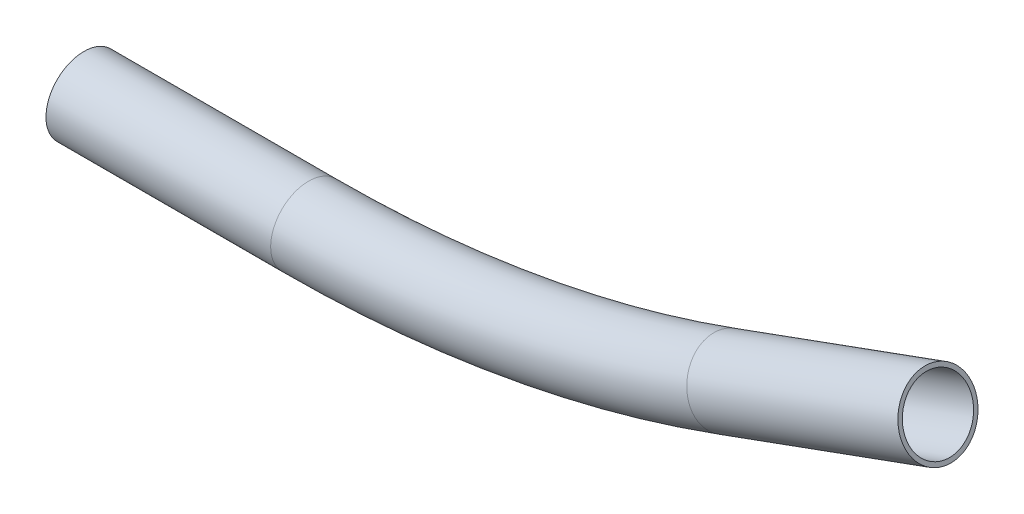
ISO-10303-21;
HEADER;
FILE_DESCRIPTION(('STEP AP214'),'2;1');
FILE_NAME('part.step','',(''),(''),'','','');
FILE_SCHEMA(('AUTOMOTIVE_DESIGN { 1 0 10303 214 1 1 1 1 }'));
ENDSEC;
DATA;
#1=APPLICATION_CONTEXT('core data for automotive mechanical design processes');
#2=APPLICATION_PROTOCOL_DEFINITION('international standard','automotive_design',2000,#1);
#3=PRODUCT_CONTEXT('',#1,'mechanical');
#4=PRODUCT('Part','Part','',(#3));
#5=PRODUCT_RELATED_PRODUCT_CATEGORY('part','',(#4));
#6=PRODUCT_DEFINITION_FORMATION('','',#4);
#7=PRODUCT_DEFINITION_CONTEXT('part definition',#1,'design');
#8=PRODUCT_DEFINITION('design','',#6,#7);
#9=PRODUCT_DEFINITION_SHAPE('','',#8);
#10=(LENGTH_UNIT() NAMED_UNIT(*) SI_UNIT(.MILLI.,.METRE.));
#11=(NAMED_UNIT(*) PLANE_ANGLE_UNIT() SI_UNIT($,.RADIAN.));
#12=(NAMED_UNIT(*) SI_UNIT($,.STERADIAN.) SOLID_ANGLE_UNIT());
#13=UNCERTAINTY_MEASURE_WITH_UNIT(LENGTH_MEASURE(1.E-05),#10,'distance_accuracy_value','');
#14=(GEOMETRIC_REPRESENTATION_CONTEXT(3) GLOBAL_UNCERTAINTY_ASSIGNED_CONTEXT((#13)) GLOBAL_UNIT_ASSIGNED_CONTEXT((#10,
#11,#12)) REPRESENTATION_CONTEXT('',''));
#15=CARTESIAN_POINT('',(0.,0.,0.));
#16=DIRECTION('',(0.,0.,1.));
#17=DIRECTION('',(1.,0.,0.));
#18=AXIS2_PLACEMENT_3D('',#15,#16,#17);
#19=CARTESIAN_POINT('',(1453.71795539644,166.755591676837,0.));
#20=DIRECTION('',(0.939692620785908,0.34202014332567,0.));
#21=DIRECTION('',(-0.34202014332567,0.939692620785908,0.));
#22=AXIS2_PLACEMENT_3D('',#19,#20,#21);
#23=CYLINDRICAL_SURFACE('',#22,85.725);
#24=CARTESIAN_POINT('',(1453.71795539644,166.755591676837,0.));
#25=DIRECTION('',(0.939692620785908,0.34202014332567,0.));
#26=DIRECTION('',(0.,0.,-1.));
#27=AXIS2_PLACEMENT_3D('',#24,#25,#26);
#28=CIRCLE('',#27,85.725);
#29=CARTESIAN_POINT('',(1483.03763218303,86.2004417599658,0.));
#30=VERTEX_POINT('',#29);
#31=EDGE_CURVE('E41',#30,#30,#28,.T.);
#32=ORIENTED_EDGE('',*,*,#31,.T.);
#33=EDGE_LOOP('',(#32));
#34=FACE_BOUND('',#33,.T.);
#35=CARTESIAN_POINT('',(1931.08180675568,340.501824486278,0.));
#36=DIRECTION('',(0.939692620785908,0.34202014332567,0.));
#37=DIRECTION('',(0.,0.,-1.));
#38=AXIS2_PLACEMENT_3D('',#35,#36,#37);
#39=CIRCLE('',#38,85.725);
#40=CARTESIAN_POINT('',(1931.08180675568,340.501824486278,-85.725));
#41=VERTEX_POINT('',#40);
#42=EDGE_CURVE('E10',#41,#41,#39,.T.);
#43=ORIENTED_EDGE('',*,*,#42,.F.);
#44=EDGE_LOOP('',(#43));
#45=FACE_BOUND('',#44,.T.);
#46=ADVANCED_FACE('F31',(#34,#45),#23,.T.);
#47=CARTESIAN_POINT('',(1453.71795539644,166.755591676837,0.));
#48=DIRECTION('',(0.939692620785908,0.34202014332567,0.));
#49=DIRECTION('',(-0.34202014332567,0.939692620785908,0.));
#50=AXIS2_PLACEMENT_3D('',#47,#48,#49);
#51=CYLINDRICAL_SURFACE('',#50,76.2);
#52=CARTESIAN_POINT('',(1453.71795539644,166.755591676837,0.));
#53=DIRECTION('',(0.939692620785908,0.34202014332567,0.));
#54=DIRECTION('',(0.,0.,-1.));
#55=AXIS2_PLACEMENT_3D('',#52,#53,#54);
#56=CIRCLE('',#55,76.2);
#57=CARTESIAN_POINT('',(1479.77989031786,95.1510139729512,0.));
#58=VERTEX_POINT('',#57);
#59=EDGE_CURVE('E45',#58,#58,#56,.T.);
#60=ORIENTED_EDGE('',*,*,#59,.F.);
#61=EDGE_LOOP('',(#60));
#62=FACE_BOUND('',#61,.T.);
#63=CARTESIAN_POINT('',(1931.08180675568,340.501824486278,0.));
#64=DIRECTION('',(0.939692620785908,0.34202014332567,0.));
#65=DIRECTION('',(0.,0.,-1.));
#66=AXIS2_PLACEMENT_3D('',#63,#64,#65);
#67=CIRCLE('',#66,76.2);
#68=CARTESIAN_POINT('',(1931.08180675568,340.501824486278,-76.2));
#69=VERTEX_POINT('',#68);
#70=EDGE_CURVE('E37',#69,#69,#67,.T.);
#71=ORIENTED_EDGE('',*,*,#70,.T.);
#72=EDGE_LOOP('',(#71));
#73=FACE_BOUND('',#72,.T.);
#74=ADVANCED_FACE('F82',(#62,#73),#51,.F.);
#75=CARTESIAN_POINT('',(508.,2765.09431930135,0.));
#76=DIRECTION('',(0.,0.,1.));
#77=DIRECTION('',(1.,0.,0.));
#78=AXIS2_PLACEMENT_3D('',#75,#76,#77);
#79=TOROIDAL_SURFACE('',#78,2765.09431930135,85.725);
#80=CARTESIAN_POINT('',(507.999999999999,0.,0.));
#81=DIRECTION('',(1.,0.,0.));
#82=DIRECTION('',(0.,0.,-1.));
#83=AXIS2_PLACEMENT_3D('',#80,#81,#82);
#84=CIRCLE('',#83,85.725);
#85=CARTESIAN_POINT('',(507.999999999999,-85.7250000000001,0.));
#86=VERTEX_POINT('',#85);
#87=EDGE_CURVE('E50',#86,#86,#84,.T.);
#88=CARTESIAN_POINT('',(508.,2765.09431930135,0.));
#89=DIRECTION('',(0.,0.,1.));
#90=DIRECTION('',(1.,0.,0.));
#91=AXIS2_PLACEMENT_3D('',#88,#89,#90);
#92=CIRCLE('',#91,2850.81931930135);
#93=EDGE_CURVE('',#86,#30,#92,.T.);
#94=ORIENTED_EDGE('',*,*,#87,.T.);
#95=ORIENTED_EDGE('',*,*,#31,.F.);
#96=ORIENTED_EDGE('',*,*,#93,.T.);
#97=ORIENTED_EDGE('',*,*,#93,.F.);
#98=EDGE_LOOP('',(#94,#96,#95,#97));
#99=FACE_BOUND('',#98,.T.);
#100=ADVANCED_FACE('F78',(#99),#79,.T.);
#101=CARTESIAN_POINT('',(508.,2765.09431930135,0.));
#102=DIRECTION('',(0.,0.,1.));
#103=DIRECTION('',(1.,0.,0.));
#104=AXIS2_PLACEMENT_3D('',#101,#102,#103);
#105=TOROIDAL_SURFACE('',#104,2765.09431930135,76.2);
#106=CARTESIAN_POINT('',(507.999999999999,0.,0.));
#107=DIRECTION('',(1.,0.,0.));
#108=DIRECTION('',(0.,0.,-1.));
#109=AXIS2_PLACEMENT_3D('',#106,#107,#108);
#110=CIRCLE('',#109,76.2);
#111=CARTESIAN_POINT('',(507.999999999999,-76.2,0.));
#112=VERTEX_POINT('',#111);
#113=EDGE_CURVE('E53',#112,#112,#110,.T.);
#114=CARTESIAN_POINT('',(508.,2765.09431930135,0.));
#115=DIRECTION('',(0.,0.,1.));
#116=DIRECTION('',(1.,0.,0.));
#117=AXIS2_PLACEMENT_3D('',#114,#115,#116);
#118=CIRCLE('',#117,2841.29431930135);
#119=EDGE_CURVE('',#112,#58,#118,.T.);
#120=ORIENTED_EDGE('',*,*,#113,.F.);
#121=ORIENTED_EDGE('',*,*,#59,.T.);
#122=ORIENTED_EDGE('',*,*,#119,.T.);
#123=ORIENTED_EDGE('',*,*,#119,.F.);
#124=EDGE_LOOP('',(#120,#122,#121,#123));
#125=FACE_BOUND('',#124,.T.);
#126=ADVANCED_FACE('F69',(#125),#105,.F.);
#127=CARTESIAN_POINT('',(507.999999999999,0.,0.));
#128=DIRECTION('',(-1.,0.,0.));
#129=DIRECTION('',(0.,0.,1.));
#130=AXIS2_PLACEMENT_3D('',#127,#128,#129);
#131=CYLINDRICAL_SURFACE('',#130,76.2);
#132=ORIENTED_EDGE('',*,*,#113,.T.);
#133=EDGE_LOOP('',(#132));
#134=FACE_BOUND('',#133,.T.);
#135=CARTESIAN_POINT('',(0.,0.,0.));
#136=DIRECTION('',(1.,0.,0.));
#137=DIRECTION('',(0.,0.,-1.));
#138=AXIS2_PLACEMENT_3D('',#135,#136,#137);
#139=CIRCLE('',#138,76.2);
#140=CARTESIAN_POINT('',(0.,0.,-76.2));
#141=VERTEX_POINT('',#140);
#142=EDGE_CURVE('E59',#141,#141,#139,.T.);
#143=ORIENTED_EDGE('',*,*,#142,.F.);
#144=EDGE_LOOP('',(#143));
#145=FACE_BOUND('',#144,.T.);
#146=ADVANCED_FACE('F66',(#134,#145),#131,.F.);
#147=CARTESIAN_POINT('',(507.999999999999,0.,0.));
#148=DIRECTION('',(-1.,0.,0.));
#149=DIRECTION('',(0.,0.,1.));
#150=AXIS2_PLACEMENT_3D('',#147,#148,#149);
#151=CYLINDRICAL_SURFACE('',#150,85.725);
#152=ORIENTED_EDGE('',*,*,#87,.F.);
#153=EDGE_LOOP('',(#152));
#154=FACE_BOUND('',#153,.T.);
#155=CARTESIAN_POINT('',(0.,0.,0.));
#156=DIRECTION('',(1.,0.,0.));
#157=DIRECTION('',(0.,0.,-1.));
#158=AXIS2_PLACEMENT_3D('',#155,#156,#157);
#159=CIRCLE('',#158,85.725);
#160=CARTESIAN_POINT('',(0.,0.,-85.725));
#161=VERTEX_POINT('',#160);
#162=EDGE_CURVE('E56',#161,#161,#159,.T.);
#163=ORIENTED_EDGE('',*,*,#162,.T.);
#164=EDGE_LOOP('',(#163));
#165=FACE_BOUND('',#164,.T.);
#166=ADVANCED_FACE('F68',(#154,#165),#151,.T.);
#167=CARTESIAN_POINT('',(1931.08180675568,340.501824486278,0.));
#168=DIRECTION('',(0.939692620785908,0.34202014332567,0.));
#169=DIRECTION('',(0.,0.,-1.));
#170=AXIS2_PLACEMENT_3D('',#167,#168,#169);
#171=PLANE('',#170);
#172=ORIENTED_EDGE('',*,*,#70,.F.);
#173=EDGE_LOOP('',(#172));
#174=FACE_BOUND('',#173,.T.);
#175=ORIENTED_EDGE('',*,*,#42,.T.);
#176=EDGE_LOOP('',(#175));
#177=FACE_BOUND('',#176,.T.);
#178=ADVANCED_FACE('F75',(#174,#177),#171,.T.);
#179=CARTESIAN_POINT('',(0.,0.,0.));
#180=DIRECTION('',(1.,0.,0.));
#181=DIRECTION('',(0.,0.,-1.));
#182=AXIS2_PLACEMENT_3D('',#179,#180,#181);
#183=PLANE('',#182);
#184=ORIENTED_EDGE('',*,*,#142,.T.);
#185=EDGE_LOOP('',(#184));
#186=FACE_BOUND('',#185,.T.);
#187=ORIENTED_EDGE('',*,*,#162,.F.);
#188=EDGE_LOOP('',(#187));
#189=FACE_BOUND('',#188,.T.);
#190=ADVANCED_FACE('F63',(#186,#189),#183,.F.);
#191=CLOSED_SHELL('',(#46,#74,#100,#126,#146,#166,#178,#190));
#192=MANIFOLD_SOLID_BREP('B2',#191);
#193=ADVANCED_BREP_SHAPE_REPRESENTATION('',(#18,#192),#14);
#194=SHAPE_DEFINITION_REPRESENTATION(#9,#193);
ENDSEC;
END-ISO-10303-21;
